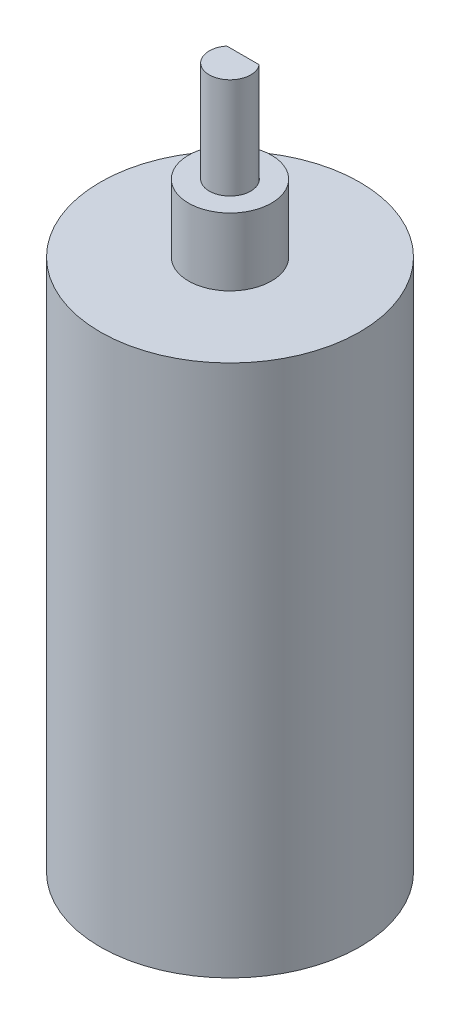
ISO-10303-21;
HEADER;
FILE_DESCRIPTION(('STEP AP214'),'2;1');
FILE_NAME('part.step','',(''),(''),'','','');
FILE_SCHEMA(('AUTOMOTIVE_DESIGN { 1 0 10303 214 1 1 1 1 }'));
ENDSEC;
DATA;
#1=APPLICATION_CONTEXT('core data for automotive mechanical design processes');
#2=APPLICATION_PROTOCOL_DEFINITION('international standard','automotive_design',2000,#1);
#3=PRODUCT_CONTEXT('',#1,'mechanical');
#4=PRODUCT('Part','Part','',(#3));
#5=PRODUCT_RELATED_PRODUCT_CATEGORY('part','',(#4));
#6=PRODUCT_DEFINITION_FORMATION('','',#4);
#7=PRODUCT_DEFINITION_CONTEXT('part definition',#1,'design');
#8=PRODUCT_DEFINITION('design','',#6,#7);
#9=PRODUCT_DEFINITION_SHAPE('','',#8);
#10=(LENGTH_UNIT() NAMED_UNIT(*) SI_UNIT(.MILLI.,.METRE.));
#11=(NAMED_UNIT(*) PLANE_ANGLE_UNIT() SI_UNIT($,.RADIAN.));
#12=(NAMED_UNIT(*) SI_UNIT($,.STERADIAN.) SOLID_ANGLE_UNIT());
#13=UNCERTAINTY_MEASURE_WITH_UNIT(LENGTH_MEASURE(1.E-05),#10,'distance_accuracy_value','');
#14=(GEOMETRIC_REPRESENTATION_CONTEXT(3) GLOBAL_UNCERTAINTY_ASSIGNED_CONTEXT((#13)) GLOBAL_UNIT_ASSIGNED_CONTEXT((#10,
#11,#12)) REPRESENTATION_CONTEXT('',''));
#15=CARTESIAN_POINT('',(0.,0.,0.));
#16=DIRECTION('',(0.,0.,1.));
#17=DIRECTION('',(1.,0.,0.));
#18=AXIS2_PLACEMENT_3D('',#15,#16,#17);
#19=CARTESIAN_POINT('',(0.,41.85,0.));
#20=DIRECTION('',(0.,1.,0.));
#21=DIRECTION('',(0.,0.,1.));
#22=AXIS2_PLACEMENT_3D('',#19,#20,#21);
#23=PLANE('',#22);
#24=CARTESIAN_POINT('',(0.,41.85,0.));
#25=DIRECTION('',(0.,1.,0.));
#26=DIRECTION('',(0.,0.,1.));
#27=AXIS2_PLACEMENT_3D('',#24,#25,#26);
#28=CIRCLE('',#27,2.);
#29=CARTESIAN_POINT('',(-1.5612494995996,41.85,-1.25));
#30=VERTEX_POINT('',#29);
#31=CARTESIAN_POINT('',(1.5612494995996,41.85,-1.25));
#32=VERTEX_POINT('',#31);
#33=EDGE_CURVE('E104',#30,#32,#28,.T.);
#34=ORIENTED_EDGE('',*,*,#33,.T.);
#35=DIRECTION('',(-1.,0.,0.));
#36=VECTOR('',#35,1.);
#37=CARTESIAN_POINT('',(0.,41.85,-1.25));
#38=LINE('',#37,#36);
#39=EDGE_CURVE('E90',#32,#30,#38,.T.);
#40=ORIENTED_EDGE('',*,*,#39,.T.);
#41=EDGE_LOOP('',(#34,#40));
#42=FACE_BOUND('',#41,.T.);
#43=ADVANCED_FACE('F48',(#42),#23,.T.);
#44=CARTESIAN_POINT('',(0.,41.85,0.));
#45=DIRECTION('',(0.,-1.,0.));
#46=DIRECTION('',(0.,0.,-1.));
#47=AXIS2_PLACEMENT_3D('',#44,#45,#46);
#48=CYLINDRICAL_SURFACE('',#47,2.);
#49=DIRECTION('',(0.,-1.,0.));
#50=VECTOR('',#49,1.);
#51=CARTESIAN_POINT('',(1.5612494995996,41.85,-1.25));
#52=LINE('',#51,#50);
#53=CARTESIAN_POINT('',(1.5612494995996,32.15,-1.25));
#54=VERTEX_POINT('',#53);
#55=EDGE_CURVE('E13',#32,#54,#52,.T.);
#56=ORIENTED_EDGE('',*,*,#55,.F.);
#57=ORIENTED_EDGE('',*,*,#33,.F.);
#58=DIRECTION('',(0.,-1.,0.));
#59=VECTOR('',#58,1.);
#60=CARTESIAN_POINT('',(-1.5612494995996,41.85,-1.25));
#61=LINE('',#60,#59);
#62=CARTESIAN_POINT('',(-1.5612494995996,32.15,-1.25));
#63=VERTEX_POINT('',#62);
#64=EDGE_CURVE('E56',#63,#30,#61,.F.);
#65=ORIENTED_EDGE('',*,*,#64,.F.);
#66=CARTESIAN_POINT('',(0.,32.15,0.));
#67=DIRECTION('',(0.,1.,0.));
#68=DIRECTION('',(0.,0.,1.));
#69=AXIS2_PLACEMENT_3D('',#66,#67,#68);
#70=CIRCLE('',#69,2.);
#71=EDGE_CURVE('E101',#63,#54,#70,.T.);
#72=ORIENTED_EDGE('',*,*,#71,.T.);
#73=EDGE_LOOP('',(#56,#57,#65,#72));
#74=FACE_BOUND('',#73,.T.);
#75=ADVANCED_FACE('F120',(#74),#48,.T.);
#76=CARTESIAN_POINT('',(0.,25.65,0.));
#77=DIRECTION('',(0.,-1.,0.));
#78=DIRECTION('',(0.,0.,-1.));
#79=AXIS2_PLACEMENT_3D('',#76,#77,#78);
#80=CYLINDRICAL_SURFACE('',#79,12.5);
#81=CARTESIAN_POINT('',(0.,25.65,0.));
#82=DIRECTION('',(0.,1.,0.));
#83=DIRECTION('',(0.,0.,1.));
#84=AXIS2_PLACEMENT_3D('',#81,#82,#83);
#85=CIRCLE('',#84,12.5);
#86=CARTESIAN_POINT('',(0.,25.65,12.5));
#87=VERTEX_POINT('',#86);
#88=EDGE_CURVE('E110',#87,#87,#85,.T.);
#89=ORIENTED_EDGE('',*,*,#88,.F.);
#90=EDGE_LOOP('',(#89));
#91=FACE_BOUND('',#90,.T.);
#92=CARTESIAN_POINT('',(0.,-25.65,0.));
#93=DIRECTION('',(0.,1.,0.));
#94=DIRECTION('',(0.,0.,1.));
#95=AXIS2_PLACEMENT_3D('',#92,#93,#94);
#96=CIRCLE('',#95,12.5);
#97=CARTESIAN_POINT('',(0.,-25.65,12.5));
#98=VERTEX_POINT('',#97);
#99=EDGE_CURVE('E109',#98,#98,#96,.T.);
#100=ORIENTED_EDGE('',*,*,#99,.T.);
#101=EDGE_LOOP('',(#100));
#102=FACE_BOUND('',#101,.T.);
#103=ADVANCED_FACE('F50',(#91,#102),#80,.T.);
#104=CARTESIAN_POINT('',(0.,25.65,0.));
#105=DIRECTION('',(0.,1.,0.));
#106=DIRECTION('',(0.,0.,1.));
#107=AXIS2_PLACEMENT_3D('',#104,#105,#106);
#108=PLANE('',#107);
#109=CARTESIAN_POINT('',(0.,25.65,0.));
#110=DIRECTION('',(0.,1.,0.));
#111=DIRECTION('',(0.,0.,1.));
#112=AXIS2_PLACEMENT_3D('',#109,#110,#111);
#113=CIRCLE('',#112,4.);
#114=CARTESIAN_POINT('',(0.,25.65,-4.));
#115=VERTEX_POINT('',#114);
#116=EDGE_CURVE('E98',#115,#115,#113,.T.);
#117=ORIENTED_EDGE('',*,*,#116,.F.);
#118=EDGE_LOOP('',(#117));
#119=FACE_BOUND('',#118,.T.);
#120=ORIENTED_EDGE('',*,*,#88,.T.);
#121=EDGE_LOOP('',(#120));
#122=FACE_BOUND('',#121,.T.);
#123=ADVANCED_FACE('F135',(#119,#122),#108,.T.);
#124=CARTESIAN_POINT('',(0.,-25.65,0.));
#125=DIRECTION('',(0.,1.,0.));
#126=DIRECTION('',(0.,0.,1.));
#127=AXIS2_PLACEMENT_3D('',#124,#125,#126);
#128=PLANE('',#127);
#129=ORIENTED_EDGE('',*,*,#99,.F.);
#130=EDGE_LOOP('',(#129));
#131=FACE_BOUND('',#130,.T.);
#132=ADVANCED_FACE('F131',(#131),#128,.F.);
#133=CARTESIAN_POINT('',(0.,32.15,0.));
#134=DIRECTION('',(0.,-1.,0.));
#135=DIRECTION('',(0.,0.,-1.));
#136=AXIS2_PLACEMENT_3D('',#133,#134,#135);
#137=CYLINDRICAL_SURFACE('',#136,4.);
#138=CARTESIAN_POINT('',(0.,32.15,0.));
#139=DIRECTION('',(0.,1.,0.));
#140=DIRECTION('',(0.,0.,1.));
#141=AXIS2_PLACEMENT_3D('',#138,#139,#140);
#142=CIRCLE('',#141,4.);
#143=CARTESIAN_POINT('',(0.,32.15,-4.));
#144=VERTEX_POINT('',#143);
#145=EDGE_CURVE('E100',#144,#144,#142,.T.);
#146=CARTESIAN_POINT('',(0.,32.15,-4.));
#147=CARTESIAN_POINT('',(0.,32.0822916666667,-4.));
#148=CARTESIAN_POINT('',(0.,32.0145833333333,-4.));
#149=CARTESIAN_POINT('',(0.,31.8791666666667,-4.));
#150=CARTESIAN_POINT('',(0.,31.8114583333333,-4.));
#151=CARTESIAN_POINT('',(0.,31.6760416666667,-4.));
#152=CARTESIAN_POINT('',(0.,31.6083333333333,-4.));
#153=CARTESIAN_POINT('',(0.,31.4729166666667,-4.));
#154=CARTESIAN_POINT('',(0.,31.4052083333333,-4.));
#155=CARTESIAN_POINT('',(0.,31.2697916666667,-4.));
#156=CARTESIAN_POINT('',(0.,31.2020833333333,-4.));
#157=CARTESIAN_POINT('',(0.,31.0666666666667,-4.));
#158=CARTESIAN_POINT('',(0.,30.9989583333333,-4.));
#159=CARTESIAN_POINT('',(0.,30.8635416666667,-4.));
#160=CARTESIAN_POINT('',(0.,30.7958333333333,-4.));
#161=CARTESIAN_POINT('',(0.,30.6604166666667,-4.));
#162=CARTESIAN_POINT('',(0.,30.5927083333333,-4.));
#163=CARTESIAN_POINT('',(0.,30.4572916666667,-4.));
#164=CARTESIAN_POINT('',(0.,30.3895833333333,-4.));
#165=CARTESIAN_POINT('',(0.,30.2541666666667,-4.));
#166=CARTESIAN_POINT('',(0.,30.1864583333333,-4.));
#167=CARTESIAN_POINT('',(0.,30.0510416666667,-4.));
#168=CARTESIAN_POINT('',(0.,29.9833333333333,-4.));
#169=CARTESIAN_POINT('',(0.,29.8479166666667,-4.));
#170=CARTESIAN_POINT('',(0.,29.7802083333333,-4.));
#171=CARTESIAN_POINT('',(0.,29.6447916666667,-4.));
#172=CARTESIAN_POINT('',(0.,29.5770833333333,-4.));
#173=CARTESIAN_POINT('',(0.,29.4416666666667,-4.));
#174=CARTESIAN_POINT('',(0.,29.3739583333333,-4.));
#175=CARTESIAN_POINT('',(0.,29.2385416666667,-4.));
#176=CARTESIAN_POINT('',(0.,29.1708333333333,-4.));
#177=CARTESIAN_POINT('',(0.,29.0354166666667,-4.));
#178=CARTESIAN_POINT('',(0.,28.9677083333333,-4.));
#179=CARTESIAN_POINT('',(0.,28.8322916666667,-4.));
#180=CARTESIAN_POINT('',(0.,28.7645833333333,-4.));
#181=CARTESIAN_POINT('',(0.,28.6291666666667,-4.));
#182=CARTESIAN_POINT('',(0.,28.5614583333333,-4.));
#183=CARTESIAN_POINT('',(0.,28.4260416666667,-4.));
#184=CARTESIAN_POINT('',(0.,28.3583333333333,-4.));
#185=CARTESIAN_POINT('',(0.,28.2229166666667,-4.));
#186=CARTESIAN_POINT('',(0.,28.1552083333333,-4.));
#187=CARTESIAN_POINT('',(0.,28.0197916666667,-4.));
#188=CARTESIAN_POINT('',(0.,27.9520833333333,-4.));
#189=CARTESIAN_POINT('',(0.,27.8166666666667,-4.));
#190=CARTESIAN_POINT('',(0.,27.7489583333333,-4.));
#191=CARTESIAN_POINT('',(0.,27.6135416666667,-4.));
#192=CARTESIAN_POINT('',(0.,27.5458333333333,-4.));
#193=CARTESIAN_POINT('',(0.,27.4104166666667,-4.));
#194=CARTESIAN_POINT('',(0.,27.3427083333333,-4.));
#195=CARTESIAN_POINT('',(0.,27.2072916666667,-4.));
#196=CARTESIAN_POINT('',(0.,27.1395833333333,-4.));
#197=CARTESIAN_POINT('',(0.,27.0041666666667,-4.));
#198=CARTESIAN_POINT('',(0.,26.9364583333333,-4.));
#199=CARTESIAN_POINT('',(0.,26.8010416666667,-4.));
#200=CARTESIAN_POINT('',(0.,26.7333333333333,-4.));
#201=CARTESIAN_POINT('',(0.,26.5979166666667,-4.));
#202=CARTESIAN_POINT('',(0.,26.5302083333333,-4.));
#203=CARTESIAN_POINT('',(0.,26.3947916666667,-4.));
#204=CARTESIAN_POINT('',(0.,26.3270833333333,-4.));
#205=CARTESIAN_POINT('',(0.,26.1916666666667,-4.));
#206=CARTESIAN_POINT('',(0.,26.1239583333333,-4.));
#207=CARTESIAN_POINT('',(0.,25.9885416666667,-4.));
#208=CARTESIAN_POINT('',(0.,25.9208333333333,-4.));
#209=CARTESIAN_POINT('',(0.,25.7854166666667,-4.));
#210=CARTESIAN_POINT('',(0.,25.7177083333333,-4.));
#211=CARTESIAN_POINT('',(0.,25.65,-4.));
#212=B_SPLINE_CURVE_WITH_KNOTS('',3,(#146,#147,#148,#149,#150,#151,#152,#153,#154,#155,#156,
#157,#158,#159,#160,#161,#162,#163,#164,#165,#166,#167,#168,#169,#170,#171,#172,#173,#174,#175,
#176,#177,#178,#179,#180,#181,#182,#183,#184,#185,#186,#187,#188,#189,#190,#191,#192,#193,#194,
#195,#196,#197,#198,#199,#200,#201,#202,#203,#204,#205,#206,#207,#208,#209,#210,#211),
.UNSPECIFIED.,.F.,.F.,(4,2,2,2,2,2,2,2,2,2,2,2,2,2,2,2,2,2,2,2,2,2,2,2,2,2,2,2,2,2,2,2,4),(0.,
0.203125000000005,0.406250000000004,0.609375000000002,0.812500000000001,1.015625,1.21875,
1.421875,1.625,1.828125,2.03125,2.234375,2.4375,2.640625,2.84375,3.046875,3.25,3.453125,3.65625,
3.859375,4.0625,4.265625,4.46875,4.671875,4.875,5.078125,5.28125,5.484375,5.6875,5.890625,
6.09375,6.296875,6.5),.UNSPECIFIED.);
#213=EDGE_CURVE('BSEAM125',#144,#115,#212,.T.);
#214=ORIENTED_EDGE('',*,*,#145,.F.);
#215=ORIENTED_EDGE('',*,*,#116,.T.);
#216=ORIENTED_EDGE('',*,*,#213,.T.);
#217=ORIENTED_EDGE('',*,*,#213,.F.);
#218=EDGE_LOOP('',(#214,#216,#215,#217));
#219=FACE_BOUND('',#218,.T.);
#220=ADVANCED_FACE('F125',(#219),#137,.T.);
#221=CARTESIAN_POINT('',(0.,32.15,0.));
#222=DIRECTION('',(0.,1.,0.));
#223=DIRECTION('',(0.,0.,1.));
#224=AXIS2_PLACEMENT_3D('',#221,#222,#223);
#225=PLANE('',#224);
#226=EDGE_CURVE('E84',#54,#63,#70,.T.);
#227=ORIENTED_EDGE('',*,*,#226,.F.);
#228=ORIENTED_EDGE('',*,*,#71,.F.);
#229=EDGE_LOOP('',(#227,#228));
#230=FACE_BOUND('',#229,.T.);
#231=ORIENTED_EDGE('',*,*,#145,.T.);
#232=EDGE_LOOP('',(#231));
#233=FACE_BOUND('',#232,.T.);
#234=ADVANCED_FACE('F122',(#230,#233),#225,.T.);
#235=CARTESIAN_POINT('',(0.,56.3613081446663,-1.25));
#236=DIRECTION('',(0.,0.,-1.));
#237=DIRECTION('',(-1.,0.,0.));
#238=AXIS2_PLACEMENT_3D('',#235,#236,#237);
#239=PLANE('',#238);
#240=ORIENTED_EDGE('',*,*,#55,.T.);
#241=DIRECTION('',(0.,-1.,0.));
#242=VECTOR('',#241,1.);
#243=CARTESIAN_POINT('',(1.5612494995996,56.3613081446663,-1.25));
#244=LINE('',#243,#242);
#245=CARTESIAN_POINT('',(1.5612494995996,25.65,-1.25));
#246=VERTEX_POINT('',#245);
#247=EDGE_CURVE('E70',#54,#246,#244,.T.);
#248=ORIENTED_EDGE('',*,*,#247,.T.);
#249=DIRECTION('',(1.,0.,0.));
#250=VECTOR('',#249,1.);
#251=CARTESIAN_POINT('',(0.,25.65,-1.25));
#252=LINE('',#251,#250);
#253=CARTESIAN_POINT('',(-1.5612494995996,25.65,-1.25));
#254=VERTEX_POINT('',#253);
#255=EDGE_CURVE('E86',#254,#246,#252,.T.);
#256=ORIENTED_EDGE('',*,*,#255,.F.);
#257=DIRECTION('',(0.,-1.,0.));
#258=VECTOR('',#257,1.);
#259=CARTESIAN_POINT('',(-1.5612494995996,56.3613081446663,-1.25));
#260=LINE('',#259,#258);
#261=EDGE_CURVE('E63',#63,#254,#260,.T.);
#262=ORIENTED_EDGE('',*,*,#261,.F.);
#263=ORIENTED_EDGE('',*,*,#64,.T.);
#264=ORIENTED_EDGE('',*,*,#39,.F.);
#265=EDGE_LOOP('',(#240,#248,#256,#262,#263,#264));
#266=FACE_BOUND('',#265,.T.);
#267=ADVANCED_FACE('F92',(#266),#239,.T.);
#268=CARTESIAN_POINT('',(0.,56.3613081446663,0.));
#269=DIRECTION('',(0.,-1.,0.));
#270=DIRECTION('',(0.,0.,-1.));
#271=AXIS2_PLACEMENT_3D('',#268,#269,#270);
#272=CYLINDRICAL_SURFACE('',#271,2.);
#273=ORIENTED_EDGE('',*,*,#261,.T.);
#274=CARTESIAN_POINT('',(0.,25.65,0.));
#275=DIRECTION('',(0.,1.,0.));
#276=DIRECTION('',(0.,0.,1.));
#277=AXIS2_PLACEMENT_3D('',#274,#275,#276);
#278=CIRCLE('',#277,2.);
#279=EDGE_CURVE('E81',#246,#254,#278,.T.);
#280=ORIENTED_EDGE('',*,*,#279,.F.);
#281=ORIENTED_EDGE('',*,*,#247,.F.);
#282=ORIENTED_EDGE('',*,*,#226,.T.);
#283=EDGE_LOOP('',(#273,#280,#281,#282));
#284=FACE_BOUND('',#283,.T.);
#285=ADVANCED_FACE('F80',(#284),#272,.F.);
#286=CARTESIAN_POINT('',(0.,25.65,0.));
#287=DIRECTION('',(0.,1.,0.));
#288=DIRECTION('',(0.,0.,1.));
#289=AXIS2_PLACEMENT_3D('',#286,#287,#288);
#290=PLANE('',#289);
#291=ORIENTED_EDGE('',*,*,#255,.T.);
#292=ORIENTED_EDGE('',*,*,#279,.T.);
#293=EDGE_LOOP('',(#291,#292));
#294=FACE_BOUND('',#293,.T.);
#295=ADVANCED_FACE('F89',(#294),#290,.T.);
#296=CLOSED_SHELL('',(#43,#75,#103,#123,#132,#220,#234,#267,#285,#295));
#297=MANIFOLD_SOLID_BREP('B2',#296);
#298=ADVANCED_BREP_SHAPE_REPRESENTATION('',(#18,#297),#14);
#299=SHAPE_DEFINITION_REPRESENTATION(#9,#298);
ENDSEC;
END-ISO-10303-21;
